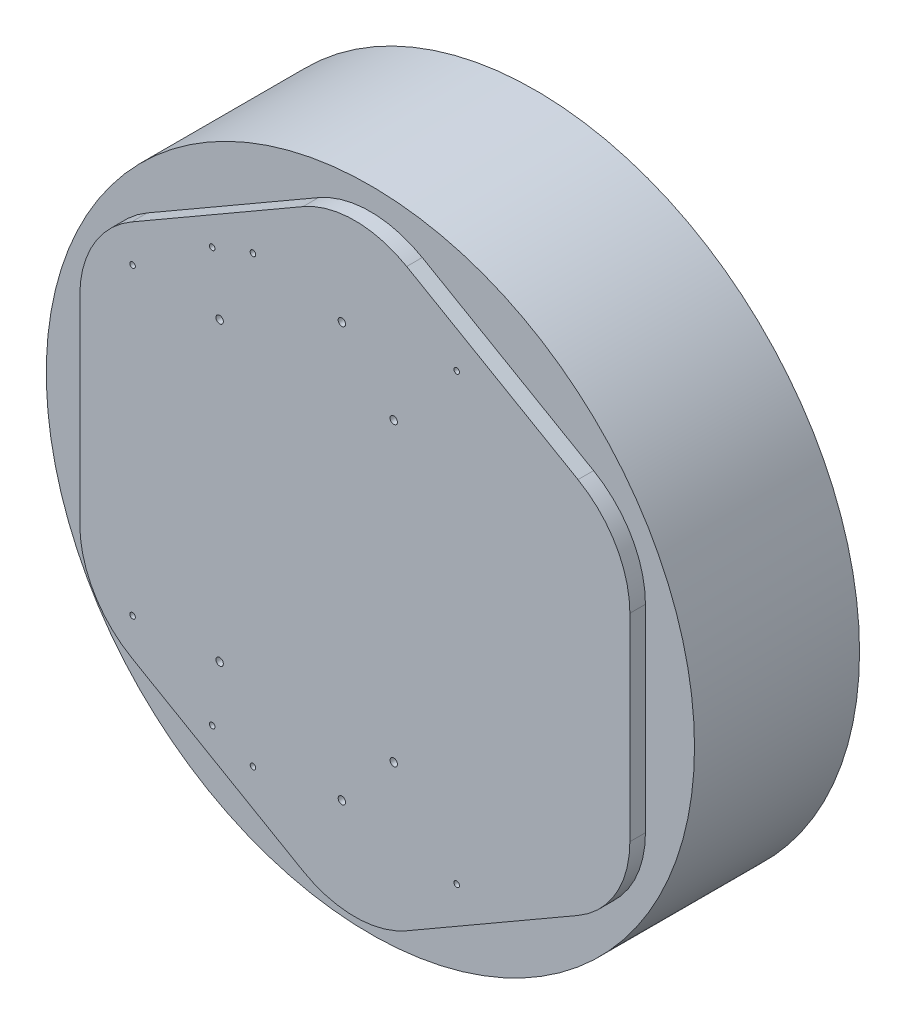
ISO-10303-21;
HEADER;
FILE_DESCRIPTION(('STEP AP214'),'2;1');
FILE_NAME('part.step','',(''),(''),'','','');
FILE_SCHEMA(('AUTOMOTIVE_DESIGN { 1 0 10303 214 1 1 1 1 }'));
ENDSEC;
DATA;
#1=APPLICATION_CONTEXT('core data for automotive mechanical design processes');
#2=APPLICATION_PROTOCOL_DEFINITION('international standard','automotive_design',2000,#1);
#3=PRODUCT_CONTEXT('',#1,'mechanical');
#4=PRODUCT('Part','Part','',(#3));
#5=PRODUCT_RELATED_PRODUCT_CATEGORY('part','',(#4));
#6=PRODUCT_DEFINITION_FORMATION('','',#4);
#7=PRODUCT_DEFINITION_CONTEXT('part definition',#1,'design');
#8=PRODUCT_DEFINITION('design','',#6,#7);
#9=PRODUCT_DEFINITION_SHAPE('','',#8);
#10=(LENGTH_UNIT() NAMED_UNIT(*) SI_UNIT(.MILLI.,.METRE.));
#11=(NAMED_UNIT(*) PLANE_ANGLE_UNIT() SI_UNIT($,.RADIAN.));
#12=(NAMED_UNIT(*) SI_UNIT($,.STERADIAN.) SOLID_ANGLE_UNIT());
#13=UNCERTAINTY_MEASURE_WITH_UNIT(LENGTH_MEASURE(1.E-05),#10,'distance_accuracy_value','');
#14=(GEOMETRIC_REPRESENTATION_CONTEXT(3) GLOBAL_UNCERTAINTY_ASSIGNED_CONTEXT((#13)) GLOBAL_UNIT_ASSIGNED_CONTEXT((#10,
#11,#12)) REPRESENTATION_CONTEXT('',''));
#15=CARTESIAN_POINT('',(0.,0.,0.));
#16=DIRECTION('',(0.,0.,1.));
#17=DIRECTION('',(1.,0.,0.));
#18=AXIS2_PLACEMENT_3D('',#15,#16,#17);
#19=CARTESIAN_POINT('',(0.,0.,97.5));
#20=DIRECTION('',(0.,0.,1.));
#21=DIRECTION('',(1.,0.,0.));
#22=AXIS2_PLACEMENT_3D('',#19,#20,#21);
#23=PLANE('',#22);
#24=CARTESIAN_POINT('',(-120.,82.,97.5));
#25=DIRECTION('',(0.,0.,1.));
#26=DIRECTION('',(1.,0.,0.));
#27=AXIS2_PLACEMENT_3D('',#24,#25,#26);
#28=CIRCLE('',#27,1.50000000000001);
#29=CARTESIAN_POINT('',(-118.5,82.,97.5));
#30=VERTEX_POINT('',#29);
#31=EDGE_CURVE('E302',#30,#30,#28,.T.);
#32=ORIENTED_EDGE('',*,*,#31,.F.);
#33=EDGE_LOOP('',(#32));
#34=FACE_BOUND('',#33,.T.);
#35=CARTESIAN_POINT('',(-55.,120.,97.5));
#36=DIRECTION('',(0.,0.,1.));
#37=DIRECTION('',(1.,0.,0.));
#38=AXIS2_PLACEMENT_3D('',#35,#36,#37);
#39=CIRCLE('',#38,1.5);
#40=CARTESIAN_POINT('',(-53.5,120.,97.5));
#41=VERTEX_POINT('',#40);
#42=EDGE_CURVE('E296',#41,#41,#39,.T.);
#43=ORIENTED_EDGE('',*,*,#42,.F.);
#44=EDGE_LOOP('',(#43));
#45=FACE_BOUND('',#44,.T.);
#46=CARTESIAN_POINT('',(-77.,111.8,97.5));
#47=DIRECTION('',(0.,0.,1.));
#48=DIRECTION('',(1.,0.,0.));
#49=AXIS2_PLACEMENT_3D('',#46,#47,#48);
#50=CIRCLE('',#49,1.5);
#51=CARTESIAN_POINT('',(-75.5,111.8,97.5));
#52=VERTEX_POINT('',#51);
#53=EDGE_CURVE('E290',#52,#52,#50,.T.);
#54=ORIENTED_EDGE('',*,*,#53,.F.);
#55=EDGE_LOOP('',(#54));
#56=FACE_BOUND('',#55,.T.);
#57=CARTESIAN_POINT('',(55.,120.,97.5));
#58=DIRECTION('',(0.,0.,1.));
#59=DIRECTION('',(1.,0.,0.));
#60=AXIS2_PLACEMENT_3D('',#57,#58,#59);
#61=CIRCLE('',#60,1.5);
#62=CARTESIAN_POINT('',(56.5,120.,97.5));
#63=VERTEX_POINT('',#62);
#64=EDGE_CURVE('E284',#63,#63,#61,.T.);
#65=ORIENTED_EDGE('',*,*,#64,.F.);
#66=EDGE_LOOP('',(#65));
#67=FACE_BOUND('',#66,.T.);
#68=CARTESIAN_POINT('',(-6.99999999999999,111.8,97.5));
#69=DIRECTION('',(0.,0.,1.));
#70=DIRECTION('',(1.,0.,0.));
#71=AXIS2_PLACEMENT_3D('',#68,#69,#70);
#72=CIRCLE('',#71,2.);
#73=CARTESIAN_POINT('',(-4.99999999999999,111.8,97.5));
#74=VERTEX_POINT('',#73);
#75=EDGE_CURVE('E278',#74,#74,#72,.T.);
#76=ORIENTED_EDGE('',*,*,#75,.F.);
#77=EDGE_LOOP('',(#76));
#78=FACE_BOUND('',#77,.T.);
#79=CARTESIAN_POINT('',(-73.,80.,97.5));
#80=DIRECTION('',(0.,0.,1.));
#81=DIRECTION('',(1.,0.,0.));
#82=AXIS2_PLACEMENT_3D('',#79,#80,#81);
#83=CIRCLE('',#82,2.);
#84=CARTESIAN_POINT('',(-71.,80.,97.5));
#85=VERTEX_POINT('',#84);
#86=EDGE_CURVE('E272',#85,#85,#83,.T.);
#87=ORIENTED_EDGE('',*,*,#86,.F.);
#88=EDGE_LOOP('',(#87));
#89=FACE_BOUND('',#88,.T.);
#90=CARTESIAN_POINT('',(21.,80.,97.5));
#91=DIRECTION('',(0.,0.,1.));
#92=DIRECTION('',(1.,0.,0.));
#93=AXIS2_PLACEMENT_3D('',#90,#91,#92);
#94=CIRCLE('',#93,2.);
#95=CARTESIAN_POINT('',(23.,80.,97.5));
#96=VERTEX_POINT('',#95);
#97=EDGE_CURVE('E266',#96,#96,#94,.T.);
#98=ORIENTED_EDGE('',*,*,#97,.F.);
#99=EDGE_LOOP('',(#98));
#100=FACE_BOUND('',#99,.T.);
#101=CARTESIAN_POINT('',(21.,-80.,97.5));
#102=DIRECTION('',(0.,0.,1.));
#103=DIRECTION('',(-1.,0.,0.));
#104=AXIS2_PLACEMENT_3D('',#101,#102,#103);
#105=CIRCLE('',#104,2.);
#106=CARTESIAN_POINT('',(19.,-80.,97.5));
#107=VERTEX_POINT('',#106);
#108=EDGE_CURVE('E260',#107,#107,#105,.T.);
#109=ORIENTED_EDGE('',*,*,#108,.F.);
#110=EDGE_LOOP('',(#109));
#111=FACE_BOUND('',#110,.T.);
#112=CARTESIAN_POINT('',(-73.,-80.,97.5));
#113=DIRECTION('',(0.,0.,1.));
#114=DIRECTION('',(-1.,0.,0.));
#115=AXIS2_PLACEMENT_3D('',#112,#113,#114);
#116=CIRCLE('',#115,2.);
#117=CARTESIAN_POINT('',(-75.,-80.,97.5));
#118=VERTEX_POINT('',#117);
#119=EDGE_CURVE('E254',#118,#118,#116,.T.);
#120=ORIENTED_EDGE('',*,*,#119,.F.);
#121=EDGE_LOOP('',(#120));
#122=FACE_BOUND('',#121,.T.);
#123=CARTESIAN_POINT('',(-6.99999999999999,-111.8,97.5));
#124=DIRECTION('',(0.,0.,1.));
#125=DIRECTION('',(-1.,0.,0.));
#126=AXIS2_PLACEMENT_3D('',#123,#124,#125);
#127=CIRCLE('',#126,2.);
#128=CARTESIAN_POINT('',(-8.99999999999999,-111.8,97.5));
#129=VERTEX_POINT('',#128);
#130=EDGE_CURVE('E248',#129,#129,#127,.T.);
#131=ORIENTED_EDGE('',*,*,#130,.F.);
#132=EDGE_LOOP('',(#131));
#133=FACE_BOUND('',#132,.T.);
#134=CARTESIAN_POINT('',(55.,-120.,97.5));
#135=DIRECTION('',(0.,0.,1.));
#136=DIRECTION('',(-1.,0.,0.));
#137=AXIS2_PLACEMENT_3D('',#134,#135,#136);
#138=CIRCLE('',#137,1.5);
#139=CARTESIAN_POINT('',(53.5,-120.,97.5));
#140=VERTEX_POINT('',#139);
#141=EDGE_CURVE('E242',#140,#140,#138,.T.);
#142=ORIENTED_EDGE('',*,*,#141,.F.);
#143=EDGE_LOOP('',(#142));
#144=FACE_BOUND('',#143,.T.);
#145=CARTESIAN_POINT('',(-77.,-111.8,97.5));
#146=DIRECTION('',(0.,0.,1.));
#147=DIRECTION('',(-1.,0.,0.));
#148=AXIS2_PLACEMENT_3D('',#145,#146,#147);
#149=CIRCLE('',#148,1.5);
#150=CARTESIAN_POINT('',(-78.5,-111.8,97.5));
#151=VERTEX_POINT('',#150);
#152=EDGE_CURVE('E236',#151,#151,#149,.T.);
#153=ORIENTED_EDGE('',*,*,#152,.F.);
#154=EDGE_LOOP('',(#153));
#155=FACE_BOUND('',#154,.T.);
#156=CARTESIAN_POINT('',(-55.,-120.,97.5));
#157=DIRECTION('',(0.,0.,1.));
#158=DIRECTION('',(-1.,0.,0.));
#159=AXIS2_PLACEMENT_3D('',#156,#157,#158);
#160=CIRCLE('',#159,1.5);
#161=CARTESIAN_POINT('',(-56.5,-120.,97.5));
#162=VERTEX_POINT('',#161);
#163=EDGE_CURVE('E229',#162,#162,#160,.T.);
#164=ORIENTED_EDGE('',*,*,#163,.F.);
#165=EDGE_LOOP('',(#164));
#166=FACE_BOUND('',#165,.T.);
#167=CARTESIAN_POINT('',(-120.,-82.,97.5));
#168=DIRECTION('',(0.,0.,1.));
#169=DIRECTION('',(-1.,0.,0.));
#170=AXIS2_PLACEMENT_3D('',#167,#168,#169);
#171=CIRCLE('',#170,1.50000000000001);
#172=CARTESIAN_POINT('',(-121.5,-82.,97.5));
#173=VERTEX_POINT('',#172);
#174=EDGE_CURVE('E230',#173,#173,#171,.T.);
#175=ORIENTED_EDGE('',*,*,#174,.F.);
#176=EDGE_LOOP('',(#175));
#177=FACE_BOUND('',#176,.T.);
#178=DIRECTION('',(-0.866025403784439,0.5,0.));
#179=VECTOR('',#178,1.);
#180=CARTESIAN_POINT('',(120.5,101.902322511969,97.5));
#181=LINE('',#180,#179);
#182=CARTESIAN_POINT('',(120.5,101.902322511969,97.5));
#183=VERTEX_POINT('',#182);
#184=CARTESIAN_POINT('',(28.0000000000002,155.307222412009,97.5));
#185=VERTEX_POINT('',#184);
#186=EDGE_CURVE('E147',#183,#185,#181,.T.);
#187=ORIENTED_EDGE('',*,*,#186,.T.);
#188=CARTESIAN_POINT('',(0.,106.809799800081,97.5));
#189=DIRECTION('',(0.,0.,1.));
#190=DIRECTION('',(1.,0.,0.));
#191=AXIS2_PLACEMENT_3D('',#188,#189,#190);
#192=CIRCLE('',#191,56.);
#193=CARTESIAN_POINT('',(-28.0000000000002,155.307222412009,97.5));
#194=VERTEX_POINT('',#193);
#195=EDGE_CURVE('E179',#185,#194,#192,.T.);
#196=ORIENTED_EDGE('',*,*,#195,.T.);
#197=DIRECTION('',(-0.866025403784438,-0.5,0.));
#198=VECTOR('',#197,1.);
#199=CARTESIAN_POINT('',(-28.0000000000002,155.307222412009,97.5));
#200=LINE('',#199,#198);
#201=CARTESIAN_POINT('',(-120.5,101.902322511969,97.5));
#202=VERTEX_POINT('',#201);
#203=EDGE_CURVE('E130',#194,#202,#200,.T.);
#204=ORIENTED_EDGE('',*,*,#203,.T.);
#205=CARTESIAN_POINT('',(-92.5,53.4048999000404,97.5));
#206=DIRECTION('',(0.,0.,1.));
#207=DIRECTION('',(1.,0.,0.));
#208=AXIS2_PLACEMENT_3D('',#205,#206,#207);
#209=CIRCLE('',#208,56.);
#210=CARTESIAN_POINT('',(-148.5,53.4048999000401,97.5));
#211=VERTEX_POINT('',#210);
#212=EDGE_CURVE('E50',#202,#211,#209,.T.);
#213=ORIENTED_EDGE('',*,*,#212,.T.);
#214=DIRECTION('',(0.,-1.,0.));
#215=VECTOR('',#214,1.);
#216=CARTESIAN_POINT('',(-148.5,53.4048999000401,97.5));
#217=LINE('',#216,#215);
#218=CARTESIAN_POINT('',(-148.5,-53.4048999000402,97.5));
#219=VERTEX_POINT('',#218);
#220=EDGE_CURVE('E183',#211,#219,#217,.T.);
#221=ORIENTED_EDGE('',*,*,#220,.T.);
#222=CARTESIAN_POINT('',(-92.5,-53.4048999000404,97.5));
#223=DIRECTION('',(0.,0.,1.));
#224=DIRECTION('',(1.,0.,0.));
#225=AXIS2_PLACEMENT_3D('',#222,#223,#224);
#226=CIRCLE('',#225,56.);
#227=CARTESIAN_POINT('',(-120.5,-101.902322511969,97.5));
#228=VERTEX_POINT('',#227);
#229=EDGE_CURVE('E186',#219,#228,#226,.T.);
#230=ORIENTED_EDGE('',*,*,#229,.T.);
#231=DIRECTION('',(0.866025403784438,-0.5,0.));
#232=VECTOR('',#231,1.);
#233=CARTESIAN_POINT('',(-120.5,-101.902322511969,97.5));
#234=LINE('',#233,#232);
#235=CARTESIAN_POINT('',(-28.0000000000002,-155.307222412009,97.5));
#236=VERTEX_POINT('',#235);
#237=EDGE_CURVE('E189',#228,#236,#234,.T.);
#238=ORIENTED_EDGE('',*,*,#237,.T.);
#239=CARTESIAN_POINT('',(0.,-106.809799800081,97.5));
#240=DIRECTION('',(0.,0.,1.));
#241=DIRECTION('',(-1.,0.,0.));
#242=AXIS2_PLACEMENT_3D('',#239,#240,#241);
#243=CIRCLE('',#242,56.);
#244=CARTESIAN_POINT('',(28.0000000000002,-155.307222412009,97.5));
#245=VERTEX_POINT('',#244);
#246=EDGE_CURVE('E192',#236,#245,#243,.T.);
#247=ORIENTED_EDGE('',*,*,#246,.T.);
#248=DIRECTION('',(0.866025403784438,0.5,0.));
#249=VECTOR('',#248,1.);
#250=CARTESIAN_POINT('',(28.0000000000002,-155.307222412009,97.5));
#251=LINE('',#250,#249);
#252=CARTESIAN_POINT('',(120.5,-101.902322511969,97.5));
#253=VERTEX_POINT('',#252);
#254=EDGE_CURVE('E195',#245,#253,#251,.T.);
#255=ORIENTED_EDGE('',*,*,#254,.T.);
#256=CARTESIAN_POINT('',(92.5,-53.4048999000403,97.5));
#257=DIRECTION('',(0.,0.,1.));
#258=DIRECTION('',(1.,0.,0.));
#259=AXIS2_PLACEMENT_3D('',#256,#257,#258);
#260=CIRCLE('',#259,56.);
#261=CARTESIAN_POINT('',(148.5,-53.4048999000401,97.5));
#262=VERTEX_POINT('',#261);
#263=EDGE_CURVE('E198',#253,#262,#260,.T.);
#264=ORIENTED_EDGE('',*,*,#263,.T.);
#265=DIRECTION('',(0.,1.,0.));
#266=VECTOR('',#265,1.);
#267=CARTESIAN_POINT('',(148.5,-53.4048999000401,97.5));
#268=LINE('',#267,#266);
#269=CARTESIAN_POINT('',(148.5,53.4048999000402,97.5));
#270=VERTEX_POINT('',#269);
#271=EDGE_CURVE('E201',#262,#270,#268,.T.);
#272=ORIENTED_EDGE('',*,*,#271,.T.);
#273=CARTESIAN_POINT('',(92.5,53.4048999000405,97.5));
#274=DIRECTION('',(0.,0.,1.));
#275=DIRECTION('',(1.,0.,0.));
#276=AXIS2_PLACEMENT_3D('',#273,#274,#275);
#277=CIRCLE('',#276,56.);
#278=EDGE_CURVE('E150',#270,#183,#277,.T.);
#279=ORIENTED_EDGE('',*,*,#278,.T.);
#280=EDGE_LOOP('',(#187,#196,#204,#213,#221,#230,#238,#247,#255,#264,#272,#279));
#281=FACE_BOUND('',#280,.T.);
#282=ADVANCED_FACE('F34',(#34,#45,#56,#67,#78,#89,#100,#111,#122,#133,#144,#155,#166,#177,#281),
#23,.T.);
#283=CARTESIAN_POINT('',(-120.,82.,87.5));
#284=DIRECTION('',(0.,0.,1.));
#285=DIRECTION('',(1.,0.,0.));
#286=AXIS2_PLACEMENT_3D('',#283,#284,#285);
#287=CYLINDRICAL_SURFACE('',#286,1.50000000000001);
#288=CARTESIAN_POINT('',(-120.,82.,87.5));
#289=DIRECTION('',(0.,0.,1.));
#290=DIRECTION('',(1.,0.,0.));
#291=AXIS2_PLACEMENT_3D('',#288,#289,#290);
#292=CIRCLE('',#291,1.50000000000001);
#293=CARTESIAN_POINT('',(-118.5,82.,87.5));
#294=VERTEX_POINT('',#293);
#295=EDGE_CURVE('E43',#294,#294,#292,.T.);
#296=ORIENTED_EDGE('',*,*,#295,.F.);
#297=EDGE_LOOP('',(#296));
#298=FACE_BOUND('',#297,.T.);
#299=ORIENTED_EDGE('',*,*,#31,.T.);
#300=EDGE_LOOP('',(#299));
#301=FACE_BOUND('',#300,.T.);
#302=ADVANCED_FACE('F310',(#298,#301),#287,.F.);
#303=CARTESIAN_POINT('',(-120.,82.,87.5));
#304=DIRECTION('',(0.,0.,1.));
#305=DIRECTION('',(1.,0.,0.));
#306=AXIS2_PLACEMENT_3D('',#303,#304,#305);
#307=PLANE('',#306);
#308=ORIENTED_EDGE('',*,*,#295,.T.);
#309=EDGE_LOOP('',(#308));
#310=FACE_BOUND('',#309,.T.);
#311=ADVANCED_FACE('F494',(#310),#307,.T.);
#312=CARTESIAN_POINT('',(-55.,120.,87.5));
#313=DIRECTION('',(0.,0.,1.));
#314=DIRECTION('',(1.,0.,0.));
#315=AXIS2_PLACEMENT_3D('',#312,#313,#314);
#316=CYLINDRICAL_SURFACE('',#315,1.5);
#317=CARTESIAN_POINT('',(-55.,120.,87.5));
#318=DIRECTION('',(0.,0.,1.));
#319=DIRECTION('',(1.,0.,0.));
#320=AXIS2_PLACEMENT_3D('',#317,#318,#319);
#321=CIRCLE('',#320,1.5);
#322=CARTESIAN_POINT('',(-53.5,120.,87.5));
#323=VERTEX_POINT('',#322);
#324=EDGE_CURVE('E299',#323,#323,#321,.T.);
#325=ORIENTED_EDGE('',*,*,#324,.F.);
#326=EDGE_LOOP('',(#325));
#327=FACE_BOUND('',#326,.T.);
#328=ORIENTED_EDGE('',*,*,#42,.T.);
#329=EDGE_LOOP('',(#328));
#330=FACE_BOUND('',#329,.T.);
#331=ADVANCED_FACE('F490',(#327,#330),#316,.F.);
#332=CARTESIAN_POINT('',(-55.,120.,87.5));
#333=DIRECTION('',(0.,0.,1.));
#334=DIRECTION('',(1.,0.,0.));
#335=AXIS2_PLACEMENT_3D('',#332,#333,#334);
#336=PLANE('',#335);
#337=ORIENTED_EDGE('',*,*,#324,.T.);
#338=EDGE_LOOP('',(#337));
#339=FACE_BOUND('',#338,.T.);
#340=ADVANCED_FACE('F486',(#339),#336,.T.);
#341=CARTESIAN_POINT('',(-77.,111.8,87.5));
#342=DIRECTION('',(0.,0.,1.));
#343=DIRECTION('',(1.,0.,0.));
#344=AXIS2_PLACEMENT_3D('',#341,#342,#343);
#345=CYLINDRICAL_SURFACE('',#344,1.5);
#346=CARTESIAN_POINT('',(-77.,111.8,87.5));
#347=DIRECTION('',(0.,0.,1.));
#348=DIRECTION('',(1.,0.,0.));
#349=AXIS2_PLACEMENT_3D('',#346,#347,#348);
#350=CIRCLE('',#349,1.5);
#351=CARTESIAN_POINT('',(-75.5,111.8,87.5));
#352=VERTEX_POINT('',#351);
#353=EDGE_CURVE('E293',#352,#352,#350,.T.);
#354=ORIENTED_EDGE('',*,*,#353,.F.);
#355=EDGE_LOOP('',(#354));
#356=FACE_BOUND('',#355,.T.);
#357=ORIENTED_EDGE('',*,*,#53,.T.);
#358=EDGE_LOOP('',(#357));
#359=FACE_BOUND('',#358,.T.);
#360=ADVANCED_FACE('F482',(#356,#359),#345,.F.);
#361=CARTESIAN_POINT('',(-77.,111.8,87.5));
#362=DIRECTION('',(0.,0.,1.));
#363=DIRECTION('',(1.,0.,0.));
#364=AXIS2_PLACEMENT_3D('',#361,#362,#363);
#365=PLANE('',#364);
#366=ORIENTED_EDGE('',*,*,#353,.T.);
#367=EDGE_LOOP('',(#366));
#368=FACE_BOUND('',#367,.T.);
#369=ADVANCED_FACE('F478',(#368),#365,.T.);
#370=CARTESIAN_POINT('',(55.,120.,87.5));
#371=DIRECTION('',(0.,0.,1.));
#372=DIRECTION('',(1.,0.,0.));
#373=AXIS2_PLACEMENT_3D('',#370,#371,#372);
#374=CYLINDRICAL_SURFACE('',#373,1.5);
#375=CARTESIAN_POINT('',(55.,120.,87.5));
#376=DIRECTION('',(0.,0.,1.));
#377=DIRECTION('',(1.,0.,0.));
#378=AXIS2_PLACEMENT_3D('',#375,#376,#377);
#379=CIRCLE('',#378,1.5);
#380=CARTESIAN_POINT('',(56.5,120.,87.5));
#381=VERTEX_POINT('',#380);
#382=EDGE_CURVE('E287',#381,#381,#379,.T.);
#383=ORIENTED_EDGE('',*,*,#382,.F.);
#384=EDGE_LOOP('',(#383));
#385=FACE_BOUND('',#384,.T.);
#386=ORIENTED_EDGE('',*,*,#64,.T.);
#387=EDGE_LOOP('',(#386));
#388=FACE_BOUND('',#387,.T.);
#389=ADVANCED_FACE('F474',(#385,#388),#374,.F.);
#390=CARTESIAN_POINT('',(55.,120.,87.5));
#391=DIRECTION('',(0.,0.,1.));
#392=DIRECTION('',(1.,0.,0.));
#393=AXIS2_PLACEMENT_3D('',#390,#391,#392);
#394=PLANE('',#393);
#395=ORIENTED_EDGE('',*,*,#382,.T.);
#396=EDGE_LOOP('',(#395));
#397=FACE_BOUND('',#396,.T.);
#398=ADVANCED_FACE('F470',(#397),#394,.T.);
#399=CARTESIAN_POINT('',(-6.99999999999999,111.8,87.5));
#400=DIRECTION('',(0.,0.,1.));
#401=DIRECTION('',(1.,0.,0.));
#402=AXIS2_PLACEMENT_3D('',#399,#400,#401);
#403=CYLINDRICAL_SURFACE('',#402,2.);
#404=CARTESIAN_POINT('',(-6.99999999999999,111.8,87.5));
#405=DIRECTION('',(0.,0.,1.));
#406=DIRECTION('',(1.,0.,0.));
#407=AXIS2_PLACEMENT_3D('',#404,#405,#406);
#408=CIRCLE('',#407,2.);
#409=CARTESIAN_POINT('',(-4.99999999999999,111.8,87.5));
#410=VERTEX_POINT('',#409);
#411=EDGE_CURVE('E281',#410,#410,#408,.T.);
#412=ORIENTED_EDGE('',*,*,#411,.F.);
#413=EDGE_LOOP('',(#412));
#414=FACE_BOUND('',#413,.T.);
#415=ORIENTED_EDGE('',*,*,#75,.T.);
#416=EDGE_LOOP('',(#415));
#417=FACE_BOUND('',#416,.T.);
#418=ADVANCED_FACE('F466',(#414,#417),#403,.F.);
#419=CARTESIAN_POINT('',(-6.99999999999999,111.8,87.5));
#420=DIRECTION('',(0.,0.,1.));
#421=DIRECTION('',(1.,0.,0.));
#422=AXIS2_PLACEMENT_3D('',#419,#420,#421);
#423=PLANE('',#422);
#424=ORIENTED_EDGE('',*,*,#411,.T.);
#425=EDGE_LOOP('',(#424));
#426=FACE_BOUND('',#425,.T.);
#427=ADVANCED_FACE('F462',(#426),#423,.T.);
#428=CARTESIAN_POINT('',(-73.,80.,87.5));
#429=DIRECTION('',(0.,0.,1.));
#430=DIRECTION('',(1.,0.,0.));
#431=AXIS2_PLACEMENT_3D('',#428,#429,#430);
#432=CYLINDRICAL_SURFACE('',#431,2.);
#433=CARTESIAN_POINT('',(-73.,80.,87.5));
#434=DIRECTION('',(0.,0.,1.));
#435=DIRECTION('',(1.,0.,0.));
#436=AXIS2_PLACEMENT_3D('',#433,#434,#435);
#437=CIRCLE('',#436,2.);
#438=CARTESIAN_POINT('',(-71.,80.,87.5));
#439=VERTEX_POINT('',#438);
#440=EDGE_CURVE('E275',#439,#439,#437,.T.);
#441=ORIENTED_EDGE('',*,*,#440,.F.);
#442=EDGE_LOOP('',(#441));
#443=FACE_BOUND('',#442,.T.);
#444=ORIENTED_EDGE('',*,*,#86,.T.);
#445=EDGE_LOOP('',(#444));
#446=FACE_BOUND('',#445,.T.);
#447=ADVANCED_FACE('F458',(#443,#446),#432,.F.);
#448=CARTESIAN_POINT('',(-73.,80.,87.5));
#449=DIRECTION('',(0.,0.,1.));
#450=DIRECTION('',(1.,0.,0.));
#451=AXIS2_PLACEMENT_3D('',#448,#449,#450);
#452=PLANE('',#451);
#453=ORIENTED_EDGE('',*,*,#440,.T.);
#454=EDGE_LOOP('',(#453));
#455=FACE_BOUND('',#454,.T.);
#456=ADVANCED_FACE('F454',(#455),#452,.T.);
#457=CARTESIAN_POINT('',(21.,80.,87.5));
#458=DIRECTION('',(0.,0.,1.));
#459=DIRECTION('',(1.,0.,0.));
#460=AXIS2_PLACEMENT_3D('',#457,#458,#459);
#461=CYLINDRICAL_SURFACE('',#460,2.);
#462=CARTESIAN_POINT('',(21.,80.,87.5));
#463=DIRECTION('',(0.,0.,1.));
#464=DIRECTION('',(1.,0.,0.));
#465=AXIS2_PLACEMENT_3D('',#462,#463,#464);
#466=CIRCLE('',#465,2.);
#467=CARTESIAN_POINT('',(23.,80.,87.5));
#468=VERTEX_POINT('',#467);
#469=EDGE_CURVE('E269',#468,#468,#466,.T.);
#470=ORIENTED_EDGE('',*,*,#469,.F.);
#471=EDGE_LOOP('',(#470));
#472=FACE_BOUND('',#471,.T.);
#473=ORIENTED_EDGE('',*,*,#97,.T.);
#474=EDGE_LOOP('',(#473));
#475=FACE_BOUND('',#474,.T.);
#476=ADVANCED_FACE('F450',(#472,#475),#461,.F.);
#477=CARTESIAN_POINT('',(21.,80.,87.5));
#478=DIRECTION('',(0.,0.,1.));
#479=DIRECTION('',(1.,0.,0.));
#480=AXIS2_PLACEMENT_3D('',#477,#478,#479);
#481=PLANE('',#480);
#482=ORIENTED_EDGE('',*,*,#469,.T.);
#483=EDGE_LOOP('',(#482));
#484=FACE_BOUND('',#483,.T.);
#485=ADVANCED_FACE('F446',(#484),#481,.T.);
#486=CARTESIAN_POINT('',(21.,-80.,87.5));
#487=DIRECTION('',(0.,0.,1.));
#488=DIRECTION('',(1.,0.,0.));
#489=AXIS2_PLACEMENT_3D('',#486,#487,#488);
#490=CYLINDRICAL_SURFACE('',#489,2.);
#491=CARTESIAN_POINT('',(21.,-80.,87.5));
#492=DIRECTION('',(0.,0.,1.));
#493=DIRECTION('',(-1.,0.,0.));
#494=AXIS2_PLACEMENT_3D('',#491,#492,#493);
#495=CIRCLE('',#494,2.);
#496=CARTESIAN_POINT('',(19.,-80.,87.5));
#497=VERTEX_POINT('',#496);
#498=EDGE_CURVE('E263',#497,#497,#495,.T.);
#499=ORIENTED_EDGE('',*,*,#498,.F.);
#500=EDGE_LOOP('',(#499));
#501=FACE_BOUND('',#500,.T.);
#502=ORIENTED_EDGE('',*,*,#108,.T.);
#503=EDGE_LOOP('',(#502));
#504=FACE_BOUND('',#503,.T.);
#505=ADVANCED_FACE('F442',(#501,#504),#490,.F.);
#506=CARTESIAN_POINT('',(21.,-80.,87.5));
#507=DIRECTION('',(0.,0.,-1.));
#508=DIRECTION('',(-1.,0.,0.));
#509=AXIS2_PLACEMENT_3D('',#506,#507,#508);
#510=PLANE('',#509);
#511=ORIENTED_EDGE('',*,*,#498,.T.);
#512=EDGE_LOOP('',(#511));
#513=FACE_BOUND('',#512,.T.);
#514=ADVANCED_FACE('F438',(#513),#510,.F.);
#515=CARTESIAN_POINT('',(-73.,-80.,87.5));
#516=DIRECTION('',(0.,0.,1.));
#517=DIRECTION('',(1.,0.,0.));
#518=AXIS2_PLACEMENT_3D('',#515,#516,#517);
#519=CYLINDRICAL_SURFACE('',#518,2.);
#520=CARTESIAN_POINT('',(-73.,-80.,87.5));
#521=DIRECTION('',(0.,0.,1.));
#522=DIRECTION('',(-1.,0.,0.));
#523=AXIS2_PLACEMENT_3D('',#520,#521,#522);
#524=CIRCLE('',#523,2.);
#525=CARTESIAN_POINT('',(-75.,-80.,87.5));
#526=VERTEX_POINT('',#525);
#527=EDGE_CURVE('E257',#526,#526,#524,.T.);
#528=ORIENTED_EDGE('',*,*,#527,.F.);
#529=EDGE_LOOP('',(#528));
#530=FACE_BOUND('',#529,.T.);
#531=ORIENTED_EDGE('',*,*,#119,.T.);
#532=EDGE_LOOP('',(#531));
#533=FACE_BOUND('',#532,.T.);
#534=ADVANCED_FACE('F434',(#530,#533),#519,.F.);
#535=CARTESIAN_POINT('',(-73.,-80.,87.5));
#536=DIRECTION('',(0.,0.,-1.));
#537=DIRECTION('',(-1.,0.,0.));
#538=AXIS2_PLACEMENT_3D('',#535,#536,#537);
#539=PLANE('',#538);
#540=ORIENTED_EDGE('',*,*,#527,.T.);
#541=EDGE_LOOP('',(#540));
#542=FACE_BOUND('',#541,.T.);
#543=ADVANCED_FACE('F430',(#542),#539,.F.);
#544=CARTESIAN_POINT('',(-6.99999999999999,-111.8,87.5));
#545=DIRECTION('',(0.,0.,1.));
#546=DIRECTION('',(1.,0.,0.));
#547=AXIS2_PLACEMENT_3D('',#544,#545,#546);
#548=CYLINDRICAL_SURFACE('',#547,2.);
#549=CARTESIAN_POINT('',(-6.99999999999999,-111.8,87.5));
#550=DIRECTION('',(0.,0.,1.));
#551=DIRECTION('',(-1.,0.,0.));
#552=AXIS2_PLACEMENT_3D('',#549,#550,#551);
#553=CIRCLE('',#552,2.);
#554=CARTESIAN_POINT('',(-8.99999999999999,-111.8,87.5));
#555=VERTEX_POINT('',#554);
#556=EDGE_CURVE('E251',#555,#555,#553,.T.);
#557=ORIENTED_EDGE('',*,*,#556,.F.);
#558=EDGE_LOOP('',(#557));
#559=FACE_BOUND('',#558,.T.);
#560=ORIENTED_EDGE('',*,*,#130,.T.);
#561=EDGE_LOOP('',(#560));
#562=FACE_BOUND('',#561,.T.);
#563=ADVANCED_FACE('F426',(#559,#562),#548,.F.);
#564=CARTESIAN_POINT('',(-6.99999999999999,-111.8,87.5));
#565=DIRECTION('',(0.,0.,-1.));
#566=DIRECTION('',(-1.,0.,0.));
#567=AXIS2_PLACEMENT_3D('',#564,#565,#566);
#568=PLANE('',#567);
#569=ORIENTED_EDGE('',*,*,#556,.T.);
#570=EDGE_LOOP('',(#569));
#571=FACE_BOUND('',#570,.T.);
#572=ADVANCED_FACE('F422',(#571),#568,.F.);
#573=CARTESIAN_POINT('',(55.,-120.,87.5));
#574=DIRECTION('',(0.,0.,1.));
#575=DIRECTION('',(1.,0.,0.));
#576=AXIS2_PLACEMENT_3D('',#573,#574,#575);
#577=CYLINDRICAL_SURFACE('',#576,1.5);
#578=CARTESIAN_POINT('',(55.,-120.,87.5));
#579=DIRECTION('',(0.,0.,1.));
#580=DIRECTION('',(-1.,0.,0.));
#581=AXIS2_PLACEMENT_3D('',#578,#579,#580);
#582=CIRCLE('',#581,1.5);
#583=CARTESIAN_POINT('',(53.5,-120.,87.5));
#584=VERTEX_POINT('',#583);
#585=EDGE_CURVE('E245',#584,#584,#582,.T.);
#586=ORIENTED_EDGE('',*,*,#585,.F.);
#587=EDGE_LOOP('',(#586));
#588=FACE_BOUND('',#587,.T.);
#589=ORIENTED_EDGE('',*,*,#141,.T.);
#590=EDGE_LOOP('',(#589));
#591=FACE_BOUND('',#590,.T.);
#592=ADVANCED_FACE('F418',(#588,#591),#577,.F.);
#593=CARTESIAN_POINT('',(55.,-120.,87.5));
#594=DIRECTION('',(0.,0.,-1.));
#595=DIRECTION('',(-1.,0.,0.));
#596=AXIS2_PLACEMENT_3D('',#593,#594,#595);
#597=PLANE('',#596);
#598=ORIENTED_EDGE('',*,*,#585,.T.);
#599=EDGE_LOOP('',(#598));
#600=FACE_BOUND('',#599,.T.);
#601=ADVANCED_FACE('F414',(#600),#597,.F.);
#602=CARTESIAN_POINT('',(-77.,-111.8,87.5));
#603=DIRECTION('',(0.,0.,1.));
#604=DIRECTION('',(1.,0.,0.));
#605=AXIS2_PLACEMENT_3D('',#602,#603,#604);
#606=CYLINDRICAL_SURFACE('',#605,1.5);
#607=CARTESIAN_POINT('',(-77.,-111.8,87.5));
#608=DIRECTION('',(0.,0.,1.));
#609=DIRECTION('',(-1.,0.,0.));
#610=AXIS2_PLACEMENT_3D('',#607,#608,#609);
#611=CIRCLE('',#610,1.5);
#612=CARTESIAN_POINT('',(-78.5,-111.8,87.5));
#613=VERTEX_POINT('',#612);
#614=EDGE_CURVE('E239',#613,#613,#611,.T.);
#615=ORIENTED_EDGE('',*,*,#614,.F.);
#616=EDGE_LOOP('',(#615));
#617=FACE_BOUND('',#616,.T.);
#618=ORIENTED_EDGE('',*,*,#152,.T.);
#619=EDGE_LOOP('',(#618));
#620=FACE_BOUND('',#619,.T.);
#621=ADVANCED_FACE('F410',(#617,#620),#606,.F.);
#622=CARTESIAN_POINT('',(-77.,-111.8,87.5));
#623=DIRECTION('',(0.,0.,-1.));
#624=DIRECTION('',(-1.,0.,0.));
#625=AXIS2_PLACEMENT_3D('',#622,#623,#624);
#626=PLANE('',#625);
#627=ORIENTED_EDGE('',*,*,#614,.T.);
#628=EDGE_LOOP('',(#627));
#629=FACE_BOUND('',#628,.T.);
#630=ADVANCED_FACE('F406',(#629),#626,.F.);
#631=CARTESIAN_POINT('',(-55.,-120.,87.5));
#632=DIRECTION('',(0.,0.,1.));
#633=DIRECTION('',(1.,0.,0.));
#634=AXIS2_PLACEMENT_3D('',#631,#632,#633);
#635=CYLINDRICAL_SURFACE('',#634,1.5);
#636=CARTESIAN_POINT('',(-55.,-120.,87.5));
#637=DIRECTION('',(0.,0.,1.));
#638=DIRECTION('',(-1.,0.,0.));
#639=AXIS2_PLACEMENT_3D('',#636,#637,#638);
#640=CIRCLE('',#639,1.5);
#641=CARTESIAN_POINT('',(-56.5,-120.,87.5));
#642=VERTEX_POINT('',#641);
#643=EDGE_CURVE('E233',#642,#642,#640,.T.);
#644=ORIENTED_EDGE('',*,*,#643,.F.);
#645=EDGE_LOOP('',(#644));
#646=FACE_BOUND('',#645,.T.);
#647=ORIENTED_EDGE('',*,*,#163,.T.);
#648=EDGE_LOOP('',(#647));
#649=FACE_BOUND('',#648,.T.);
#650=ADVANCED_FACE('F402',(#646,#649),#635,.F.);
#651=CARTESIAN_POINT('',(-55.,-120.,87.5));
#652=DIRECTION('',(0.,0.,-1.));
#653=DIRECTION('',(-1.,0.,0.));
#654=AXIS2_PLACEMENT_3D('',#651,#652,#653);
#655=PLANE('',#654);
#656=ORIENTED_EDGE('',*,*,#643,.T.);
#657=EDGE_LOOP('',(#656));
#658=FACE_BOUND('',#657,.T.);
#659=ADVANCED_FACE('F398',(#658),#655,.F.);
#660=CARTESIAN_POINT('',(-120.,-82.,87.5));
#661=DIRECTION('',(0.,0.,1.));
#662=DIRECTION('',(1.,0.,0.));
#663=AXIS2_PLACEMENT_3D('',#660,#661,#662);
#664=CYLINDRICAL_SURFACE('',#663,1.50000000000001);
#665=CARTESIAN_POINT('',(-120.,-82.,87.5));
#666=DIRECTION('',(0.,0.,1.));
#667=DIRECTION('',(-1.,0.,0.));
#668=AXIS2_PLACEMENT_3D('',#665,#666,#667);
#669=CIRCLE('',#668,1.50000000000001);
#670=CARTESIAN_POINT('',(-121.5,-82.,87.5));
#671=VERTEX_POINT('',#670);
#672=EDGE_CURVE('E226',#671,#671,#669,.T.);
#673=ORIENTED_EDGE('',*,*,#672,.F.);
#674=EDGE_LOOP('',(#673));
#675=FACE_BOUND('',#674,.T.);
#676=ORIENTED_EDGE('',*,*,#174,.T.);
#677=EDGE_LOOP('',(#676));
#678=FACE_BOUND('',#677,.T.);
#679=ADVANCED_FACE('F394',(#675,#678),#664,.F.);
#680=CARTESIAN_POINT('',(-120.,-82.,87.5));
#681=DIRECTION('',(0.,0.,-1.));
#682=DIRECTION('',(-1.,0.,0.));
#683=AXIS2_PLACEMENT_3D('',#680,#681,#682);
#684=PLANE('',#683);
#685=ORIENTED_EDGE('',*,*,#672,.T.);
#686=EDGE_LOOP('',(#685));
#687=FACE_BOUND('',#686,.T.);
#688=ADVANCED_FACE('F391',(#687),#684,.F.);
#689=CARTESIAN_POINT('',(0.,0.,89.1));
#690=DIRECTION('',(0.,0.,1.));
#691=DIRECTION('',(1.,0.,0.));
#692=AXIS2_PLACEMENT_3D('',#689,#690,#691);
#693=PLANE('',#692);
#694=DIRECTION('',(-0.866025403784439,0.5,0.));
#695=VECTOR('',#694,1.);
#696=CARTESIAN_POINT('',(120.5,101.902322511969,89.1));
#697=LINE('',#696,#695);
#698=CARTESIAN_POINT('',(120.5,101.902322511969,89.1));
#699=VERTEX_POINT('',#698);
#700=CARTESIAN_POINT('',(28.0000000000002,155.307222412009,89.1));
#701=VERTEX_POINT('',#700);
#702=EDGE_CURVE('E136',#699,#701,#697,.T.);
#703=ORIENTED_EDGE('',*,*,#702,.F.);
#704=CARTESIAN_POINT('',(92.5,53.4048999000405,89.1));
#705=DIRECTION('',(0.,0.,1.));
#706=DIRECTION('',(1.,0.,0.));
#707=AXIS2_PLACEMENT_3D('',#704,#705,#706);
#708=CIRCLE('',#707,56.);
#709=CARTESIAN_POINT('',(148.5,53.4048999000402,89.1));
#710=VERTEX_POINT('',#709);
#711=EDGE_CURVE('E175',#710,#699,#708,.T.);
#712=ORIENTED_EDGE('',*,*,#711,.F.);
#713=DIRECTION('',(0.,1.,0.));
#714=VECTOR('',#713,1.);
#715=CARTESIAN_POINT('',(148.5,-53.4048999000401,89.1));
#716=LINE('',#715,#714);
#717=CARTESIAN_POINT('',(148.5,-53.4048999000401,89.1));
#718=VERTEX_POINT('',#717);
#719=EDGE_CURVE('E172',#718,#710,#716,.T.);
#720=ORIENTED_EDGE('',*,*,#719,.F.);
#721=CARTESIAN_POINT('',(92.5,-53.4048999000403,89.1));
#722=DIRECTION('',(0.,0.,1.));
#723=DIRECTION('',(1.,0.,0.));
#724=AXIS2_PLACEMENT_3D('',#721,#722,#723);
#725=CIRCLE('',#724,56.);
#726=CARTESIAN_POINT('',(120.5,-101.902322511969,89.1));
#727=VERTEX_POINT('',#726);
#728=EDGE_CURVE('E169',#727,#718,#725,.T.);
#729=ORIENTED_EDGE('',*,*,#728,.F.);
#730=DIRECTION('',(0.866025403784438,0.5,0.));
#731=VECTOR('',#730,1.);
#732=CARTESIAN_POINT('',(28.0000000000002,-155.307222412009,89.1));
#733=LINE('',#732,#731);
#734=CARTESIAN_POINT('',(28.0000000000002,-155.307222412009,89.1));
#735=VERTEX_POINT('',#734);
#736=EDGE_CURVE('E166',#735,#727,#733,.T.);
#737=ORIENTED_EDGE('',*,*,#736,.F.);
#738=CARTESIAN_POINT('',(0.,-106.809799800081,89.1));
#739=DIRECTION('',(0.,0.,1.));
#740=DIRECTION('',(-1.,0.,0.));
#741=AXIS2_PLACEMENT_3D('',#738,#739,#740);
#742=CIRCLE('',#741,56.);
#743=CARTESIAN_POINT('',(-28.0000000000002,-155.307222412009,89.1));
#744=VERTEX_POINT('',#743);
#745=EDGE_CURVE('E163',#744,#735,#742,.T.);
#746=ORIENTED_EDGE('',*,*,#745,.F.);
#747=DIRECTION('',(0.866025403784438,-0.5,0.));
#748=VECTOR('',#747,1.);
#749=CARTESIAN_POINT('',(-120.5,-101.902322511969,89.1));
#750=LINE('',#749,#748);
#751=CARTESIAN_POINT('',(-120.5,-101.902322511969,89.1));
#752=VERTEX_POINT('',#751);
#753=EDGE_CURVE('E160',#752,#744,#750,.T.);
#754=ORIENTED_EDGE('',*,*,#753,.F.);
#755=CARTESIAN_POINT('',(-92.5,-53.4048999000404,89.1));
#756=DIRECTION('',(0.,0.,1.));
#757=DIRECTION('',(1.,0.,0.));
#758=AXIS2_PLACEMENT_3D('',#755,#756,#757);
#759=CIRCLE('',#758,56.);
#760=CARTESIAN_POINT('',(-148.5,-53.4048999000402,89.1));
#761=VERTEX_POINT('',#760);
#762=EDGE_CURVE('E157',#761,#752,#759,.T.);
#763=ORIENTED_EDGE('',*,*,#762,.F.);
#764=DIRECTION('',(0.,-1.,0.));
#765=VECTOR('',#764,1.);
#766=CARTESIAN_POINT('',(-148.5,53.4048999000401,89.1));
#767=LINE('',#766,#765);
#768=CARTESIAN_POINT('',(-148.5,53.4048999000401,89.1));
#769=VERTEX_POINT('',#768);
#770=EDGE_CURVE('E154',#769,#761,#767,.T.);
#771=ORIENTED_EDGE('',*,*,#770,.F.);
#772=CARTESIAN_POINT('',(-92.5,53.4048999000404,89.1));
#773=DIRECTION('',(0.,0.,1.));
#774=DIRECTION('',(1.,0.,0.));
#775=AXIS2_PLACEMENT_3D('',#772,#773,#774);
#776=CIRCLE('',#775,56.);
#777=CARTESIAN_POINT('',(-120.5,101.902322511969,89.1));
#778=VERTEX_POINT('',#777);
#779=EDGE_CURVE('E58',#778,#769,#776,.T.);
#780=ORIENTED_EDGE('',*,*,#779,.F.);
#781=DIRECTION('',(-0.866025403784438,-0.5,0.));
#782=VECTOR('',#781,1.);
#783=CARTESIAN_POINT('',(-28.0000000000002,155.307222412009,89.1));
#784=LINE('',#783,#782);
#785=CARTESIAN_POINT('',(-28.0000000000002,155.307222412009,89.1));
#786=VERTEX_POINT('',#785);
#787=EDGE_CURVE('E128',#786,#778,#784,.T.);
#788=ORIENTED_EDGE('',*,*,#787,.F.);
#789=CARTESIAN_POINT('',(0.,106.809799800081,89.1));
#790=DIRECTION('',(0.,0.,1.));
#791=DIRECTION('',(1.,0.,0.));
#792=AXIS2_PLACEMENT_3D('',#789,#790,#791);
#793=CIRCLE('',#792,56.);
#794=EDGE_CURVE('E142',#701,#786,#793,.T.);
#795=ORIENTED_EDGE('',*,*,#794,.F.);
#796=EDGE_LOOP('',(#703,#712,#720,#729,#737,#746,#754,#763,#771,#780,#788,#795));
#797=FACE_BOUND('',#796,.T.);
#798=CARTESIAN_POINT('',(0.,0.,89.1));
#799=DIRECTION('',(0.,0.,1.));
#800=DIRECTION('',(1.,0.,0.));
#801=AXIS2_PLACEMENT_3D('',#798,#799,#800);
#802=CIRCLE('',#801,175.);
#803=CARTESIAN_POINT('',(175.,0.,89.1));
#804=VERTEX_POINT('',#803);
#805=EDGE_CURVE('E38',#804,#804,#802,.T.);
#806=ORIENTED_EDGE('',*,*,#805,.T.);
#807=EDGE_LOOP('',(#806));
#808=FACE_BOUND('',#807,.T.);
#809=ADVANCED_FACE('F140',(#797,#808),#693,.T.);
#810=CARTESIAN_POINT('',(0.,106.809799800081,89.1));
#811=DIRECTION('',(0.,0.,1.));
#812=DIRECTION('',(1.,0.,0.));
#813=AXIS2_PLACEMENT_3D('',#810,#811,#812);
#814=CYLINDRICAL_SURFACE('',#813,56.);
#815=ORIENTED_EDGE('',*,*,#195,.F.);
#816=DIRECTION('',(0.,0.,1.));
#817=VECTOR('',#816,1.);
#818=CARTESIAN_POINT('',(28.0000000000002,155.307222412009,89.1));
#819=LINE('',#818,#817);
#820=EDGE_CURVE('E146',#701,#185,#819,.T.);
#821=ORIENTED_EDGE('',*,*,#820,.F.);
#822=ORIENTED_EDGE('',*,*,#794,.T.);
#823=DIRECTION('',(0.,0.,1.));
#824=VECTOR('',#823,1.);
#825=CARTESIAN_POINT('',(-28.0000000000002,155.307222412009,89.1));
#826=LINE('',#825,#824);
#827=EDGE_CURVE('E126',#786,#194,#826,.T.);
#828=ORIENTED_EDGE('',*,*,#827,.T.);
#829=EDGE_LOOP('',(#815,#821,#822,#828));
#830=FACE_BOUND('',#829,.T.);
#831=ADVANCED_FACE('F145',(#830),#814,.T.);
#832=CARTESIAN_POINT('',(120.5,101.902322511969,89.1));
#833=DIRECTION('',(0.5,0.866025403784439,0.));
#834=DIRECTION('',(-0.866025403784439,0.5,0.));
#835=AXIS2_PLACEMENT_3D('',#832,#833,#834);
#836=PLANE('',#835);
#837=ORIENTED_EDGE('',*,*,#186,.F.);
#838=DIRECTION('',(0.,0.,1.));
#839=VECTOR('',#838,1.);
#840=CARTESIAN_POINT('',(120.5,101.902322511969,89.1));
#841=LINE('',#840,#839);
#842=EDGE_CURVE('E207',#699,#183,#841,.T.);
#843=ORIENTED_EDGE('',*,*,#842,.F.);
#844=ORIENTED_EDGE('',*,*,#702,.T.);
#845=ORIENTED_EDGE('',*,*,#820,.T.);
#846=EDGE_LOOP('',(#837,#843,#844,#845));
#847=FACE_BOUND('',#846,.T.);
#848=ADVANCED_FACE('F344',(#847),#836,.T.);
#849=CARTESIAN_POINT('',(92.5,53.4048999000405,89.1));
#850=DIRECTION('',(0.,0.,1.));
#851=DIRECTION('',(1.,0.,0.));
#852=AXIS2_PLACEMENT_3D('',#849,#850,#851);
#853=CYLINDRICAL_SURFACE('',#852,56.);
#854=ORIENTED_EDGE('',*,*,#278,.F.);
#855=DIRECTION('',(0.,0.,1.));
#856=VECTOR('',#855,1.);
#857=CARTESIAN_POINT('',(148.5,53.4048999000402,89.1));
#858=LINE('',#857,#856);
#859=EDGE_CURVE('E209',#710,#270,#858,.T.);
#860=ORIENTED_EDGE('',*,*,#859,.F.);
#861=ORIENTED_EDGE('',*,*,#711,.T.);
#862=ORIENTED_EDGE('',*,*,#842,.T.);
#863=EDGE_LOOP('',(#854,#860,#861,#862));
#864=FACE_BOUND('',#863,.T.);
#865=ADVANCED_FACE('F348',(#864),#853,.T.);
#866=CARTESIAN_POINT('',(148.5,-53.4048999000401,89.1));
#867=DIRECTION('',(1.,0.,0.));
#868=DIRECTION('',(0.,1.,0.));
#869=AXIS2_PLACEMENT_3D('',#866,#867,#868);
#870=PLANE('',#869);
#871=ORIENTED_EDGE('',*,*,#271,.F.);
#872=DIRECTION('',(0.,0.,1.));
#873=VECTOR('',#872,1.);
#874=CARTESIAN_POINT('',(148.5,-53.4048999000401,89.1));
#875=LINE('',#874,#873);
#876=EDGE_CURVE('E211',#718,#262,#875,.T.);
#877=ORIENTED_EDGE('',*,*,#876,.F.);
#878=ORIENTED_EDGE('',*,*,#719,.T.);
#879=ORIENTED_EDGE('',*,*,#859,.T.);
#880=EDGE_LOOP('',(#871,#877,#878,#879));
#881=FACE_BOUND('',#880,.T.);
#882=ADVANCED_FACE('F351',(#881),#870,.T.);
#883=CARTESIAN_POINT('',(92.5,-53.4048999000403,89.1));
#884=DIRECTION('',(0.,0.,1.));
#885=DIRECTION('',(1.,0.,0.));
#886=AXIS2_PLACEMENT_3D('',#883,#884,#885);
#887=CYLINDRICAL_SURFACE('',#886,56.);
#888=ORIENTED_EDGE('',*,*,#263,.F.);
#889=DIRECTION('',(0.,0.,1.));
#890=VECTOR('',#889,1.);
#891=CARTESIAN_POINT('',(120.5,-101.902322511969,89.1));
#892=LINE('',#891,#890);
#893=EDGE_CURVE('E213',#727,#253,#892,.T.);
#894=ORIENTED_EDGE('',*,*,#893,.F.);
#895=ORIENTED_EDGE('',*,*,#728,.T.);
#896=ORIENTED_EDGE('',*,*,#876,.T.);
#897=EDGE_LOOP('',(#888,#894,#895,#896));
#898=FACE_BOUND('',#897,.T.);
#899=ADVANCED_FACE('F356',(#898),#887,.T.);
#900=CARTESIAN_POINT('',(28.0000000000002,-155.307222412009,89.1));
#901=DIRECTION('',(0.5,-0.866025403784438,0.));
#902=DIRECTION('',(0.866025403784438,0.5,0.));
#903=AXIS2_PLACEMENT_3D('',#900,#901,#902);
#904=PLANE('',#903);
#905=ORIENTED_EDGE('',*,*,#254,.F.);
#906=DIRECTION('',(0.,0.,1.));
#907=VECTOR('',#906,1.);
#908=CARTESIAN_POINT('',(28.0000000000002,-155.307222412009,89.1));
#909=LINE('',#908,#907);
#910=EDGE_CURVE('E215',#735,#245,#909,.T.);
#911=ORIENTED_EDGE('',*,*,#910,.F.);
#912=ORIENTED_EDGE('',*,*,#736,.T.);
#913=ORIENTED_EDGE('',*,*,#893,.T.);
#914=EDGE_LOOP('',(#905,#911,#912,#913));
#915=FACE_BOUND('',#914,.T.);
#916=ADVANCED_FACE('F359',(#915),#904,.T.);
#917=CARTESIAN_POINT('',(0.,-106.809799800081,89.1));
#918=DIRECTION('',(0.,0.,1.));
#919=DIRECTION('',(1.,0.,0.));
#920=AXIS2_PLACEMENT_3D('',#917,#918,#919);
#921=CYLINDRICAL_SURFACE('',#920,56.);
#922=ORIENTED_EDGE('',*,*,#246,.F.);
#923=DIRECTION('',(0.,0.,1.));
#924=VECTOR('',#923,1.);
#925=CARTESIAN_POINT('',(-28.0000000000002,-155.307222412009,89.1));
#926=LINE('',#925,#924);
#927=EDGE_CURVE('E217',#744,#236,#926,.T.);
#928=ORIENTED_EDGE('',*,*,#927,.F.);
#929=ORIENTED_EDGE('',*,*,#745,.T.);
#930=ORIENTED_EDGE('',*,*,#910,.T.);
#931=EDGE_LOOP('',(#922,#928,#929,#930));
#932=FACE_BOUND('',#931,.T.);
#933=ADVANCED_FACE('F364',(#932),#921,.T.);
#934=CARTESIAN_POINT('',(-120.5,-101.902322511969,89.1));
#935=DIRECTION('',(-0.5,-0.866025403784439,0.));
#936=DIRECTION('',(0.866025403784439,-0.5,0.));
#937=AXIS2_PLACEMENT_3D('',#934,#935,#936);
#938=PLANE('',#937);
#939=ORIENTED_EDGE('',*,*,#237,.F.);
#940=DIRECTION('',(0.,0.,1.));
#941=VECTOR('',#940,1.);
#942=CARTESIAN_POINT('',(-120.5,-101.902322511969,89.1));
#943=LINE('',#942,#941);
#944=EDGE_CURVE('E219',#752,#228,#943,.T.);
#945=ORIENTED_EDGE('',*,*,#944,.F.);
#946=ORIENTED_EDGE('',*,*,#753,.T.);
#947=ORIENTED_EDGE('',*,*,#927,.T.);
#948=EDGE_LOOP('',(#939,#945,#946,#947));
#949=FACE_BOUND('',#948,.T.);
#950=ADVANCED_FACE('F367',(#949),#938,.T.);
#951=CARTESIAN_POINT('',(-92.5,-53.4048999000404,89.1));
#952=DIRECTION('',(0.,0.,1.));
#953=DIRECTION('',(1.,0.,0.));
#954=AXIS2_PLACEMENT_3D('',#951,#952,#953);
#955=CYLINDRICAL_SURFACE('',#954,56.);
#956=ORIENTED_EDGE('',*,*,#229,.F.);
#957=DIRECTION('',(0.,0.,1.));
#958=VECTOR('',#957,1.);
#959=CARTESIAN_POINT('',(-148.5,-53.4048999000402,89.1));
#960=LINE('',#959,#958);
#961=EDGE_CURVE('E221',#761,#219,#960,.T.);
#962=ORIENTED_EDGE('',*,*,#961,.F.);
#963=ORIENTED_EDGE('',*,*,#762,.T.);
#964=ORIENTED_EDGE('',*,*,#944,.T.);
#965=EDGE_LOOP('',(#956,#962,#963,#964));
#966=FACE_BOUND('',#965,.T.);
#967=ADVANCED_FACE('F371',(#966),#955,.T.);
#968=CARTESIAN_POINT('',(-148.5,53.4048999000401,89.1));
#969=DIRECTION('',(-1.,0.,0.));
#970=DIRECTION('',(0.,0.,1.));
#971=AXIS2_PLACEMENT_3D('',#968,#969,#970);
#972=PLANE('',#971);
#973=ORIENTED_EDGE('',*,*,#220,.F.);
#974=DIRECTION('',(0.,0.,1.));
#975=VECTOR('',#974,1.);
#976=CARTESIAN_POINT('',(-148.5,53.4048999000401,89.1));
#977=LINE('',#976,#975);
#978=EDGE_CURVE('E223',#769,#211,#977,.T.);
#979=ORIENTED_EDGE('',*,*,#978,.F.);
#980=ORIENTED_EDGE('',*,*,#770,.T.);
#981=ORIENTED_EDGE('',*,*,#961,.T.);
#982=EDGE_LOOP('',(#973,#979,#980,#981));
#983=FACE_BOUND('',#982,.T.);
#984=ADVANCED_FACE('F374',(#983),#972,.T.);
#985=CARTESIAN_POINT('',(-92.5,53.4048999000404,89.1));
#986=DIRECTION('',(0.,0.,1.));
#987=DIRECTION('',(1.,0.,0.));
#988=AXIS2_PLACEMENT_3D('',#985,#986,#987);
#989=CYLINDRICAL_SURFACE('',#988,56.);
#990=ORIENTED_EDGE('',*,*,#212,.F.);
#991=DIRECTION('',(0.,0.,1.));
#992=VECTOR('',#991,1.);
#993=CARTESIAN_POINT('',(-120.5,101.902322511969,89.1));
#994=LINE('',#993,#992);
#995=EDGE_CURVE('E135',#778,#202,#994,.T.);
#996=ORIENTED_EDGE('',*,*,#995,.F.);
#997=ORIENTED_EDGE('',*,*,#779,.T.);
#998=ORIENTED_EDGE('',*,*,#978,.T.);
#999=EDGE_LOOP('',(#990,#996,#997,#998));
#1000=FACE_BOUND('',#999,.T.);
#1001=ADVANCED_FACE('F375',(#1000),#989,.T.);
#1002=CARTESIAN_POINT('',(-28.0000000000002,155.307222412009,89.1));
#1003=DIRECTION('',(-0.5,0.866025403784438,0.));
#1004=DIRECTION('',(-0.866025403784439,-0.5,0.));
#1005=AXIS2_PLACEMENT_3D('',#1002,#1003,#1004);
#1006=PLANE('',#1005);
#1007=ORIENTED_EDGE('',*,*,#203,.F.);
#1008=ORIENTED_EDGE('',*,*,#827,.F.);
#1009=ORIENTED_EDGE('',*,*,#787,.T.);
#1010=ORIENTED_EDGE('',*,*,#995,.T.);
#1011=EDGE_LOOP('',(#1007,#1008,#1009,#1010));
#1012=FACE_BOUND('',#1011,.T.);
#1013=ADVANCED_FACE('F127',(#1012),#1006,.T.);
#1014=CARTESIAN_POINT('',(0.,0.,0.));
#1015=DIRECTION('',(0.,0.,1.));
#1016=DIRECTION('',(1.,0.,0.));
#1017=AXIS2_PLACEMENT_3D('',#1014,#1015,#1016);
#1018=PLANE('',#1017);
#1019=CARTESIAN_POINT('',(0.,0.,0.));
#1020=DIRECTION('',(0.,0.,1.));
#1021=DIRECTION('',(1.,0.,0.));
#1022=AXIS2_PLACEMENT_3D('',#1019,#1020,#1021);
#1023=CIRCLE('',#1022,175.);
#1024=CARTESIAN_POINT('',(175.,0.,0.));
#1025=VERTEX_POINT('',#1024);
#1026=EDGE_CURVE('E12',#1025,#1025,#1023,.T.);
#1027=ORIENTED_EDGE('',*,*,#1026,.F.);
#1028=EDGE_LOOP('',(#1027));
#1029=FACE_BOUND('',#1028,.T.);
#1030=ADVANCED_FACE('F382',(#1029),#1018,.F.);
#1031=CARTESIAN_POINT('',(0.,0.,97.5));
#1032=DIRECTION('',(0.,0.,-1.));
#1033=DIRECTION('',(-1.,0.,0.));
#1034=AXIS2_PLACEMENT_3D('',#1031,#1032,#1033);
#1035=CYLINDRICAL_SURFACE('',#1034,175.);
#1036=ORIENTED_EDGE('',*,*,#1026,.T.);
#1037=EDGE_LOOP('',(#1036));
#1038=FACE_BOUND('',#1037,.T.);
#1039=ORIENTED_EDGE('',*,*,#805,.F.);
#1040=EDGE_LOOP('',(#1039));
#1041=FACE_BOUND('',#1040,.T.);
#1042=ADVANCED_FACE('F36',(#1038,#1041),#1035,.T.);
#1043=CLOSED_SHELL('',(#282,#302,#311,#331,#340,#360,#369,#389,#398,#418,#427,#447,#456,#476,
#485,#505,#514,#534,#543,#563,#572,#592,#601,#621,#630,#650,#659,#679,#688,#809,#831,#848,#865,
#882,#899,#916,#933,#950,#967,#984,#1001,#1013,#1030,#1042));
#1044=MANIFOLD_SOLID_BREP('B2',#1043);
#1045=ADVANCED_BREP_SHAPE_REPRESENTATION('',(#18,#1044),#14);
#1046=SHAPE_DEFINITION_REPRESENTATION(#9,#1045);
ENDSEC;
END-ISO-10303-21;
